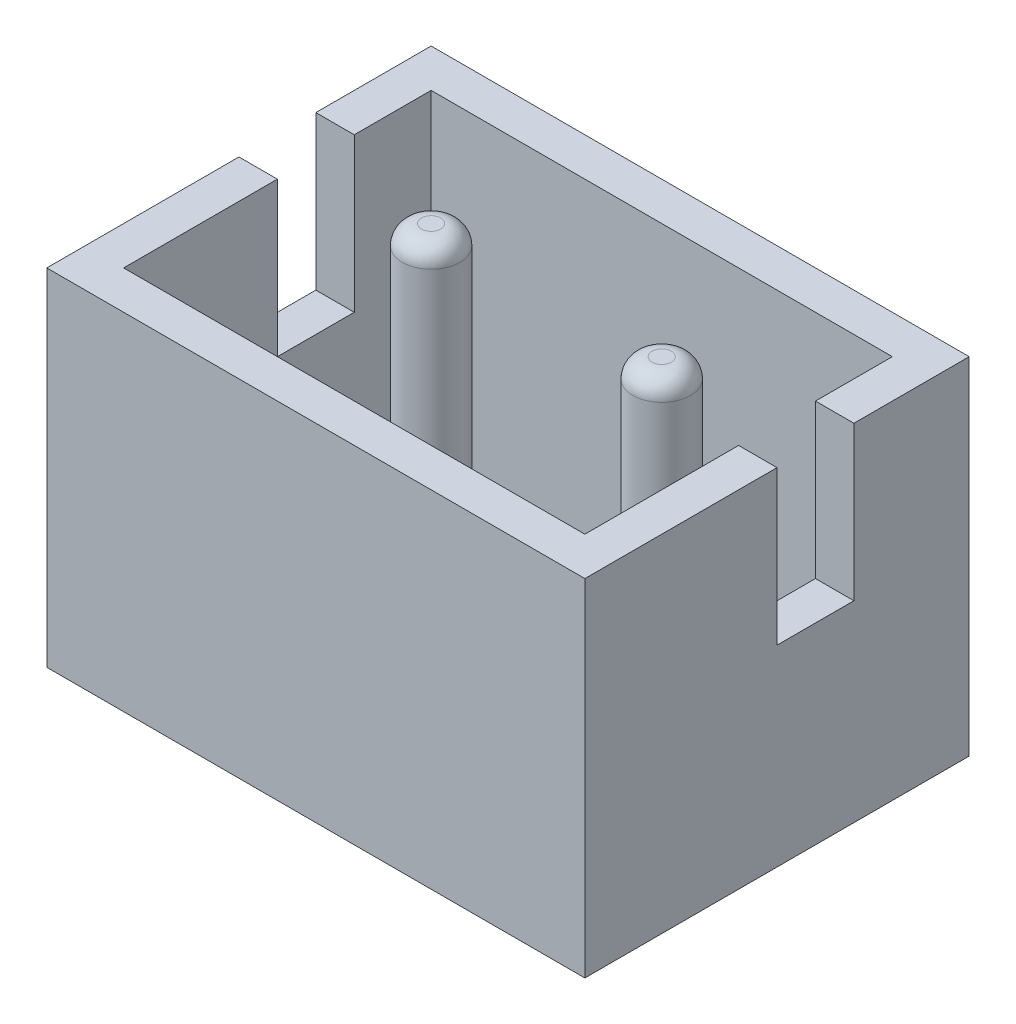
ISO-10303-21;
HEADER;
FILE_DESCRIPTION(('STEP AP214'),'2;1');
FILE_NAME('part.step','',(''),(''),'','','');
FILE_SCHEMA(('AUTOMOTIVE_DESIGN { 1 0 10303 214 1 1 1 1 }'));
ENDSEC;
DATA;
#1=APPLICATION_CONTEXT('core data for automotive mechanical design processes');
#2=APPLICATION_PROTOCOL_DEFINITION('international standard','automotive_design',2000,#1);
#3=PRODUCT_CONTEXT('',#1,'mechanical');
#4=PRODUCT('Part','Part','',(#3));
#5=PRODUCT_RELATED_PRODUCT_CATEGORY('part','',(#4));
#6=PRODUCT_DEFINITION_FORMATION('','',#4);
#7=PRODUCT_DEFINITION_CONTEXT('part definition',#1,'design');
#8=PRODUCT_DEFINITION('design','',#6,#7);
#9=PRODUCT_DEFINITION_SHAPE('','',#8);
#10=(LENGTH_UNIT() NAMED_UNIT(*) SI_UNIT(.MILLI.,.METRE.));
#11=(NAMED_UNIT(*) PLANE_ANGLE_UNIT() SI_UNIT($,.RADIAN.));
#12=(NAMED_UNIT(*) SI_UNIT($,.STERADIAN.) SOLID_ANGLE_UNIT());
#13=UNCERTAINTY_MEASURE_WITH_UNIT(LENGTH_MEASURE(1.E-05),#10,'distance_accuracy_value','');
#14=(GEOMETRIC_REPRESENTATION_CONTEXT(3) GLOBAL_UNCERTAINTY_ASSIGNED_CONTEXT((#13)) GLOBAL_UNIT_ASSIGNED_CONTEXT((#10,
#11,#12)) REPRESENTATION_CONTEXT('',''));
#15=CARTESIAN_POINT('',(0.,0.,0.));
#16=DIRECTION('',(0.,0.,1.));
#17=DIRECTION('',(1.,0.,0.));
#18=AXIS2_PLACEMENT_3D('',#15,#16,#17);
#19=CARTESIAN_POINT('',(3.,4.5,2.));
#20=DIRECTION('',(-1.,0.,0.));
#21=DIRECTION('',(0.,0.,1.));
#22=AXIS2_PLACEMENT_3D('',#19,#20,#21);
#23=PLANE('',#22);
#24=DIRECTION('',(0.,1.,0.));
#25=VECTOR('',#24,1.);
#26=CARTESIAN_POINT('',(3.,2.5,-1.));
#27=LINE('',#26,#25);
#28=CARTESIAN_POINT('',(3.,2.5,-1.));
#29=VERTEX_POINT('',#28);
#30=CARTESIAN_POINT('',(3.,4.5,-1.));
#31=VERTEX_POINT('',#30);
#32=EDGE_CURVE('E335',#29,#31,#27,.T.);
#33=ORIENTED_EDGE('',*,*,#32,.T.);
#34=DIRECTION('',(0.,0.,-1.));
#35=VECTOR('',#34,1.);
#36=CARTESIAN_POINT('',(3.,4.5,2.));
#37=LINE('',#36,#35);
#38=CARTESIAN_POINT('',(3.,4.5,-2.));
#39=VERTEX_POINT('',#38);
#40=EDGE_CURVE('E202',#31,#39,#37,.T.);
#41=ORIENTED_EDGE('',*,*,#40,.T.);
#42=DIRECTION('',(0.,-1.,0.));
#43=VECTOR('',#42,1.);
#44=CARTESIAN_POINT('',(3.,4.5,-2.));
#45=LINE('',#44,#43);
#46=CARTESIAN_POINT('',(3.,0.5,-2.));
#47=VERTEX_POINT('',#46);
#48=EDGE_CURVE('E209',#39,#47,#45,.T.);
#49=ORIENTED_EDGE('',*,*,#48,.T.);
#50=DIRECTION('',(0.,0.,-1.));
#51=VECTOR('',#50,1.);
#52=CARTESIAN_POINT('',(3.,0.5,2.));
#53=LINE('',#52,#51);
#54=CARTESIAN_POINT('',(3.,0.5,2.));
#55=VERTEX_POINT('',#54);
#56=EDGE_CURVE('E193',#55,#47,#53,.T.);
#57=ORIENTED_EDGE('',*,*,#56,.F.);
#58=DIRECTION('',(0.,-1.,0.));
#59=VECTOR('',#58,1.);
#60=CARTESIAN_POINT('',(3.,4.5,2.));
#61=LINE('',#60,#59);
#62=CARTESIAN_POINT('',(3.,4.5,2.));
#63=VERTEX_POINT('',#62);
#64=EDGE_CURVE('E186',#63,#55,#61,.T.);
#65=ORIENTED_EDGE('',*,*,#64,.F.);
#66=CARTESIAN_POINT('',(3.,4.5,0.));
#67=VERTEX_POINT('',#66);
#68=EDGE_CURVE('E327',#63,#67,#37,.T.);
#69=ORIENTED_EDGE('',*,*,#68,.T.);
#70=DIRECTION('',(0.,-1.,0.));
#71=VECTOR('',#70,1.);
#72=CARTESIAN_POINT('',(3.,4.5,0.));
#73=LINE('',#72,#71);
#74=CARTESIAN_POINT('',(3.,2.5,0.));
#75=VERTEX_POINT('',#74);
#76=EDGE_CURVE('E164',#67,#75,#73,.T.);
#77=ORIENTED_EDGE('',*,*,#76,.T.);
#78=DIRECTION('',(0.,0.,-1.));
#79=VECTOR('',#78,1.);
#80=CARTESIAN_POINT('',(3.,2.5,0.));
#81=LINE('',#80,#79);
#82=EDGE_CURVE('E358',#75,#29,#81,.T.);
#83=ORIENTED_EDGE('',*,*,#82,.T.);
#84=EDGE_LOOP('',(#33,#41,#49,#57,#65,#69,#77,#83));
#85=FACE_BOUND('',#84,.T.);
#86=ADVANCED_FACE('F39',(#85),#23,.T.);
#87=CARTESIAN_POINT('',(-3.,4.5,-2.));
#88=DIRECTION('',(0.,0.,1.));
#89=DIRECTION('',(1.,0.,0.));
#90=AXIS2_PLACEMENT_3D('',#87,#88,#89);
#91=PLANE('',#90);
#92=DIRECTION('',(-1.,0.,0.));
#93=VECTOR('',#92,1.);
#94=CARTESIAN_POINT('',(-3.,0.5,-2.));
#95=LINE('',#94,#93);
#96=CARTESIAN_POINT('',(-3.,0.5,-2.));
#97=VERTEX_POINT('',#96);
#98=EDGE_CURVE('E196',#47,#97,#95,.T.);
#99=ORIENTED_EDGE('',*,*,#98,.F.);
#100=ORIENTED_EDGE('',*,*,#48,.F.);
#101=DIRECTION('',(-1.,0.,0.));
#102=VECTOR('',#101,1.);
#103=CARTESIAN_POINT('',(-3.,4.5,-2.));
#104=LINE('',#103,#102);
#105=CARTESIAN_POINT('',(-3.,4.5,-2.));
#106=VERTEX_POINT('',#105);
#107=EDGE_CURVE('E189',#39,#106,#104,.T.);
#108=ORIENTED_EDGE('',*,*,#107,.T.);
#109=DIRECTION('',(0.,-1.,0.));
#110=VECTOR('',#109,1.);
#111=CARTESIAN_POINT('',(-3.,4.5,-2.));
#112=LINE('',#111,#110);
#113=EDGE_CURVE('E181',#106,#97,#112,.T.);
#114=ORIENTED_EDGE('',*,*,#113,.T.);
#115=EDGE_LOOP('',(#99,#100,#108,#114));
#116=FACE_BOUND('',#115,.T.);
#117=ADVANCED_FACE('F249',(#116),#91,.T.);
#118=CARTESIAN_POINT('',(-3.,4.5,2.));
#119=DIRECTION('',(1.,0.,0.));
#120=DIRECTION('',(0.,0.,-1.));
#121=AXIS2_PLACEMENT_3D('',#118,#119,#120);
#122=PLANE('',#121);
#123=DIRECTION('',(0.,-1.,0.));
#124=VECTOR('',#123,1.);
#125=CARTESIAN_POINT('',(-3.,2.5,-1.));
#126=LINE('',#125,#124);
#127=CARTESIAN_POINT('',(-3.,4.5,-1.));
#128=VERTEX_POINT('',#127);
#129=CARTESIAN_POINT('',(-3.,2.5,-1.));
#130=VERTEX_POINT('',#129);
#131=EDGE_CURVE('E154',#128,#130,#126,.T.);
#132=ORIENTED_EDGE('',*,*,#131,.T.);
#133=DIRECTION('',(0.,0.,1.));
#134=VECTOR('',#133,1.);
#135=CARTESIAN_POINT('',(-3.,2.5,0.));
#136=LINE('',#135,#134);
#137=CARTESIAN_POINT('',(-3.,2.5,0.));
#138=VERTEX_POINT('',#137);
#139=EDGE_CURVE('E165',#130,#138,#136,.T.);
#140=ORIENTED_EDGE('',*,*,#139,.T.);
#141=DIRECTION('',(0.,1.,0.));
#142=VECTOR('',#141,1.);
#143=CARTESIAN_POINT('',(-3.,4.5,0.));
#144=LINE('',#143,#142);
#145=CARTESIAN_POINT('',(-3.,4.5,0.));
#146=VERTEX_POINT('',#145);
#147=EDGE_CURVE('E346',#138,#146,#144,.T.);
#148=ORIENTED_EDGE('',*,*,#147,.T.);
#149=DIRECTION('',(0.,0.,1.));
#150=VECTOR('',#149,1.);
#151=CARTESIAN_POINT('',(-3.,4.5,2.));
#152=LINE('',#151,#150);
#153=CARTESIAN_POINT('',(-3.,4.5,2.));
#154=VERTEX_POINT('',#153);
#155=EDGE_CURVE('E183',#146,#154,#152,.T.);
#156=ORIENTED_EDGE('',*,*,#155,.T.);
#157=DIRECTION('',(0.,-1.,0.));
#158=VECTOR('',#157,1.);
#159=CARTESIAN_POINT('',(-3.,4.5,2.));
#160=LINE('',#159,#158);
#161=CARTESIAN_POINT('',(-3.,0.5,2.));
#162=VERTEX_POINT('',#161);
#163=EDGE_CURVE('E205',#154,#162,#160,.T.);
#164=ORIENTED_EDGE('',*,*,#163,.T.);
#165=DIRECTION('',(0.,0.,1.));
#166=VECTOR('',#165,1.);
#167=CARTESIAN_POINT('',(-3.,0.5,2.));
#168=LINE('',#167,#166);
#169=EDGE_CURVE('E198',#97,#162,#168,.T.);
#170=ORIENTED_EDGE('',*,*,#169,.F.);
#171=ORIENTED_EDGE('',*,*,#113,.F.);
#172=EDGE_CURVE('E169',#106,#128,#152,.T.);
#173=ORIENTED_EDGE('',*,*,#172,.T.);
#174=EDGE_LOOP('',(#132,#140,#148,#156,#164,#170,#171,#173));
#175=FACE_BOUND('',#174,.T.);
#176=ADVANCED_FACE('F178',(#175),#122,.T.);
#177=CARTESIAN_POINT('',(-3.,4.5,2.));
#178=DIRECTION('',(0.,0.,-1.));
#179=DIRECTION('',(-1.,0.,0.));
#180=AXIS2_PLACEMENT_3D('',#177,#178,#179);
#181=PLANE('',#180);
#182=DIRECTION('',(1.,0.,0.));
#183=VECTOR('',#182,1.);
#184=CARTESIAN_POINT('',(-3.,0.5,2.));
#185=LINE('',#184,#183);
#186=EDGE_CURVE('E200',#162,#55,#185,.T.);
#187=ORIENTED_EDGE('',*,*,#186,.F.);
#188=ORIENTED_EDGE('',*,*,#163,.F.);
#189=DIRECTION('',(1.,0.,0.));
#190=VECTOR('',#189,1.);
#191=CARTESIAN_POINT('',(-3.,4.5,2.));
#192=LINE('',#191,#190);
#193=EDGE_CURVE('E182',#154,#63,#192,.T.);
#194=ORIENTED_EDGE('',*,*,#193,.T.);
#195=ORIENTED_EDGE('',*,*,#64,.T.);
#196=EDGE_LOOP('',(#187,#188,#194,#195));
#197=FACE_BOUND('',#196,.T.);
#198=ADVANCED_FACE('F341',(#197),#181,.T.);
#199=CARTESIAN_POINT('',(0.,0.5,0.));
#200=DIRECTION('',(0.,1.,0.));
#201=DIRECTION('',(0.,0.,1.));
#202=AXIS2_PLACEMENT_3D('',#199,#200,#201);
#203=PLANE('',#202);
#204=CARTESIAN_POINT('',(1.5,0.5,-0.5));
#205=DIRECTION('',(0.,1.,0.));
#206=DIRECTION('',(0.,0.,1.));
#207=AXIS2_PLACEMENT_3D('',#204,#205,#206);
#208=CIRCLE('',#207,0.375);
#209=CARTESIAN_POINT('',(1.5,0.5,-0.125));
#210=VERTEX_POINT('',#209);
#211=EDGE_CURVE('E353',#210,#210,#208,.T.);
#212=ORIENTED_EDGE('',*,*,#211,.F.);
#213=EDGE_LOOP('',(#212));
#214=FACE_BOUND('',#213,.T.);
#215=CARTESIAN_POINT('',(-1.5,0.5,-0.5));
#216=DIRECTION('',(0.,1.,0.));
#217=DIRECTION('',(0.,0.,1.));
#218=AXIS2_PLACEMENT_3D('',#215,#216,#217);
#219=CIRCLE('',#218,0.375);
#220=CARTESIAN_POINT('',(-1.5,0.5,-0.125));
#221=VERTEX_POINT('',#220);
#222=EDGE_CURVE('E349',#221,#221,#219,.T.);
#223=ORIENTED_EDGE('',*,*,#222,.F.);
#224=EDGE_LOOP('',(#223));
#225=FACE_BOUND('',#224,.T.);
#226=ORIENTED_EDGE('',*,*,#56,.T.);
#227=ORIENTED_EDGE('',*,*,#98,.T.);
#228=ORIENTED_EDGE('',*,*,#169,.T.);
#229=ORIENTED_EDGE('',*,*,#186,.T.);
#230=EDGE_LOOP('',(#226,#227,#228,#229));
#231=FACE_BOUND('',#230,.T.);
#232=ADVANCED_FACE('F338',(#214,#225,#231),#203,.T.);
#233=CARTESIAN_POINT('',(-3.501,4.5,2.5));
#234=DIRECTION('',(0.,-1.,0.));
#235=DIRECTION('',(0.,0.,-1.));
#236=AXIS2_PLACEMENT_3D('',#233,#234,#235);
#237=PLANE('',#236);
#238=ORIENTED_EDGE('',*,*,#40,.F.);
#239=DIRECTION('',(1.,0.,0.));
#240=VECTOR('',#239,1.);
#241=CARTESIAN_POINT('',(-3.501,4.5,-1.));
#242=LINE('',#241,#240);
#243=CARTESIAN_POINT('',(3.5,4.5,-1.));
#244=VERTEX_POINT('',#243);
#245=EDGE_CURVE('E175',#31,#244,#242,.T.);
#246=ORIENTED_EDGE('',*,*,#245,.T.);
#247=DIRECTION('',(0.,0.,-1.));
#248=VECTOR('',#247,1.);
#249=CARTESIAN_POINT('',(3.5,4.5,-1.));
#250=LINE('',#249,#248);
#251=CARTESIAN_POINT('',(3.5,4.5,-2.5));
#252=VERTEX_POINT('',#251);
#253=EDGE_CURVE('E288',#244,#252,#250,.T.);
#254=ORIENTED_EDGE('',*,*,#253,.T.);
#255=DIRECTION('',(1.,0.,0.));
#256=VECTOR('',#255,1.);
#257=CARTESIAN_POINT('',(-3.501,4.5,-2.5));
#258=LINE('',#257,#256);
#259=CARTESIAN_POINT('',(-3.5,4.5,-2.5));
#260=VERTEX_POINT('',#259);
#261=EDGE_CURVE('E174',#260,#252,#258,.T.);
#262=ORIENTED_EDGE('',*,*,#261,.F.);
#263=DIRECTION('',(0.,0.,1.));
#264=VECTOR('',#263,1.);
#265=CARTESIAN_POINT('',(-3.5,4.5,-1.));
#266=LINE('',#265,#264);
#267=CARTESIAN_POINT('',(-3.5,4.5,-1.));
#268=VERTEX_POINT('',#267);
#269=EDGE_CURVE('E172',#260,#268,#266,.T.);
#270=ORIENTED_EDGE('',*,*,#269,.T.);
#271=EDGE_CURVE('E158',#268,#128,#242,.T.);
#272=ORIENTED_EDGE('',*,*,#271,.T.);
#273=ORIENTED_EDGE('',*,*,#172,.F.);
#274=ORIENTED_EDGE('',*,*,#107,.F.);
#275=EDGE_LOOP('',(#238,#246,#254,#262,#270,#272,#273,#274));
#276=FACE_BOUND('',#275,.T.);
#277=ADVANCED_FACE('F168',(#276),#237,.F.);
#278=CARTESIAN_POINT('',(-3.501,2.5,-1.));
#279=DIRECTION('',(0.,0.,-1.));
#280=DIRECTION('',(-1.,0.,0.));
#281=AXIS2_PLACEMENT_3D('',#278,#279,#280);
#282=PLANE('',#281);
#283=DIRECTION('',(0.,-1.,0.));
#284=VECTOR('',#283,1.);
#285=CARTESIAN_POINT('',(-3.5,2.5,-1.));
#286=LINE('',#285,#284);
#287=CARTESIAN_POINT('',(-3.5,2.5,-1.));
#288=VERTEX_POINT('',#287);
#289=EDGE_CURVE('E297',#268,#288,#286,.T.);
#290=ORIENTED_EDGE('',*,*,#289,.T.);
#291=DIRECTION('',(1.,0.,0.));
#292=VECTOR('',#291,1.);
#293=CARTESIAN_POINT('',(-3.501,2.5,-1.));
#294=LINE('',#293,#292);
#295=EDGE_CURVE('E160',#288,#130,#294,.T.);
#296=ORIENTED_EDGE('',*,*,#295,.T.);
#297=ORIENTED_EDGE('',*,*,#131,.F.);
#298=ORIENTED_EDGE('',*,*,#271,.F.);
#299=EDGE_LOOP('',(#290,#296,#297,#298));
#300=FACE_BOUND('',#299,.T.);
#301=ADVANCED_FACE('F157',(#300),#282,.F.);
#302=CARTESIAN_POINT('',(3.5,2.5,-1.));
#303=VERTEX_POINT('',#302);
#304=EDGE_CURVE('E318',#29,#303,#294,.T.);
#305=ORIENTED_EDGE('',*,*,#304,.T.);
#306=DIRECTION('',(0.,1.,0.));
#307=VECTOR('',#306,1.);
#308=CARTESIAN_POINT('',(3.5,2.5,-1.));
#309=LINE('',#308,#307);
#310=EDGE_CURVE('E312',#303,#244,#309,.T.);
#311=ORIENTED_EDGE('',*,*,#310,.T.);
#312=ORIENTED_EDGE('',*,*,#245,.F.);
#313=ORIENTED_EDGE('',*,*,#32,.F.);
#314=EDGE_LOOP('',(#305,#311,#312,#313));
#315=FACE_BOUND('',#314,.T.);
#316=ADVANCED_FACE('F413',(#315),#282,.F.);
#317=CARTESIAN_POINT('',(-3.501,2.5,0.));
#318=DIRECTION('',(0.,-1.,0.));
#319=DIRECTION('',(0.,0.,-1.));
#320=AXIS2_PLACEMENT_3D('',#317,#318,#319);
#321=PLANE('',#320);
#322=DIRECTION('',(0.,0.,1.));
#323=VECTOR('',#322,1.);
#324=CARTESIAN_POINT('',(-3.5,2.5,0.));
#325=LINE('',#324,#323);
#326=CARTESIAN_POINT('',(-3.5,2.5,0.));
#327=VERTEX_POINT('',#326);
#328=EDGE_CURVE('E303',#288,#327,#325,.T.);
#329=ORIENTED_EDGE('',*,*,#328,.T.);
#330=DIRECTION('',(1.,0.,0.));
#331=VECTOR('',#330,1.);
#332=CARTESIAN_POINT('',(-3.501,2.5,0.));
#333=LINE('',#332,#331);
#334=EDGE_CURVE('E320',#327,#138,#333,.T.);
#335=ORIENTED_EDGE('',*,*,#334,.T.);
#336=ORIENTED_EDGE('',*,*,#139,.F.);
#337=ORIENTED_EDGE('',*,*,#295,.F.);
#338=EDGE_LOOP('',(#329,#335,#336,#337));
#339=FACE_BOUND('',#338,.T.);
#340=ADVANCED_FACE('F366',(#339),#321,.F.);
#341=CARTESIAN_POINT('',(3.5,2.5,0.));
#342=VERTEX_POINT('',#341);
#343=EDGE_CURVE('E321',#75,#342,#333,.T.);
#344=ORIENTED_EDGE('',*,*,#343,.T.);
#345=DIRECTION('',(0.,0.,-1.));
#346=VECTOR('',#345,1.);
#347=CARTESIAN_POINT('',(3.5,2.5,0.));
#348=LINE('',#347,#346);
#349=EDGE_CURVE('E309',#342,#303,#348,.T.);
#350=ORIENTED_EDGE('',*,*,#349,.T.);
#351=ORIENTED_EDGE('',*,*,#304,.F.);
#352=ORIENTED_EDGE('',*,*,#82,.F.);
#353=EDGE_LOOP('',(#344,#350,#351,#352));
#354=FACE_BOUND('',#353,.T.);
#355=ADVANCED_FACE('F369',(#354),#321,.F.);
#356=CARTESIAN_POINT('',(-3.501,4.5,0.));
#357=DIRECTION('',(0.,0.,1.));
#358=DIRECTION('',(0.,-1.,0.));
#359=AXIS2_PLACEMENT_3D('',#356,#357,#358);
#360=PLANE('',#359);
#361=DIRECTION('',(0.,1.,0.));
#362=VECTOR('',#361,1.);
#363=CARTESIAN_POINT('',(-3.5,4.5,0.));
#364=LINE('',#363,#362);
#365=CARTESIAN_POINT('',(-3.5,4.5,0.));
#366=VERTEX_POINT('',#365);
#367=EDGE_CURVE('E361',#327,#366,#364,.T.);
#368=ORIENTED_EDGE('',*,*,#367,.T.);
#369=DIRECTION('',(1.,0.,0.));
#370=VECTOR('',#369,1.);
#371=CARTESIAN_POINT('',(-3.501,4.5,0.));
#372=LINE('',#371,#370);
#373=EDGE_CURVE('E323',#366,#146,#372,.T.);
#374=ORIENTED_EDGE('',*,*,#373,.T.);
#375=ORIENTED_EDGE('',*,*,#147,.F.);
#376=ORIENTED_EDGE('',*,*,#334,.F.);
#377=EDGE_LOOP('',(#368,#374,#375,#376));
#378=FACE_BOUND('',#377,.T.);
#379=ADVANCED_FACE('F367',(#378),#360,.F.);
#380=CARTESIAN_POINT('',(3.5,4.5,0.));
#381=VERTEX_POINT('',#380);
#382=EDGE_CURVE('E324',#67,#381,#372,.T.);
#383=ORIENTED_EDGE('',*,*,#382,.T.);
#384=DIRECTION('',(0.,-1.,0.));
#385=VECTOR('',#384,1.);
#386=CARTESIAN_POINT('',(3.5,4.5,0.));
#387=LINE('',#386,#385);
#388=EDGE_CURVE('E301',#381,#342,#387,.T.);
#389=ORIENTED_EDGE('',*,*,#388,.T.);
#390=ORIENTED_EDGE('',*,*,#343,.F.);
#391=ORIENTED_EDGE('',*,*,#76,.F.);
#392=EDGE_LOOP('',(#383,#389,#390,#391));
#393=FACE_BOUND('',#392,.T.);
#394=ADVANCED_FACE('F283',(#393),#360,.F.);
#395=ORIENTED_EDGE('',*,*,#68,.F.);
#396=ORIENTED_EDGE('',*,*,#193,.F.);
#397=ORIENTED_EDGE('',*,*,#155,.F.);
#398=ORIENTED_EDGE('',*,*,#373,.F.);
#399=DIRECTION('',(0.,0.,1.));
#400=VECTOR('',#399,1.);
#401=CARTESIAN_POINT('',(-3.5,4.5,2.5));
#402=LINE('',#401,#400);
#403=CARTESIAN_POINT('',(-3.5,4.5,2.5));
#404=VERTEX_POINT('',#403);
#405=EDGE_CURVE('E54',#366,#404,#402,.T.);
#406=ORIENTED_EDGE('',*,*,#405,.T.);
#407=DIRECTION('',(1.,0.,0.));
#408=VECTOR('',#407,1.);
#409=CARTESIAN_POINT('',(-3.501,4.5,2.5));
#410=LINE('',#409,#408);
#411=CARTESIAN_POINT('',(3.5,4.5,2.5));
#412=VERTEX_POINT('',#411);
#413=EDGE_CURVE('E316',#404,#412,#410,.T.);
#414=ORIENTED_EDGE('',*,*,#413,.T.);
#415=DIRECTION('',(0.,0.,-1.));
#416=VECTOR('',#415,1.);
#417=CARTESIAN_POINT('',(3.5,4.5,2.5));
#418=LINE('',#417,#416);
#419=EDGE_CURVE('E298',#412,#381,#418,.T.);
#420=ORIENTED_EDGE('',*,*,#419,.T.);
#421=ORIENTED_EDGE('',*,*,#382,.F.);
#422=EDGE_LOOP('',(#395,#396,#397,#398,#406,#414,#420,#421));
#423=FACE_BOUND('',#422,.T.);
#424=ADVANCED_FACE('F279',(#423),#237,.F.);
#425=CARTESIAN_POINT('',(3.5,5.,0.));
#426=DIRECTION('',(-1.,0.,0.));
#427=DIRECTION('',(0.,0.,1.));
#428=AXIS2_PLACEMENT_3D('',#425,#426,#427);
#429=PLANE('',#428);
#430=DIRECTION('',(0.,-1.,0.));
#431=VECTOR('',#430,1.);
#432=CARTESIAN_POINT('',(3.5,5.,-2.5));
#433=LINE('',#432,#431);
#434=CARTESIAN_POINT('',(3.5,0.,-2.5));
#435=VERTEX_POINT('',#434);
#436=EDGE_CURVE('E227',#252,#435,#433,.T.);
#437=ORIENTED_EDGE('',*,*,#436,.F.);
#438=ORIENTED_EDGE('',*,*,#253,.F.);
#439=ORIENTED_EDGE('',*,*,#310,.F.);
#440=ORIENTED_EDGE('',*,*,#349,.F.);
#441=ORIENTED_EDGE('',*,*,#388,.F.);
#442=ORIENTED_EDGE('',*,*,#419,.F.);
#443=DIRECTION('',(0.,-1.,0.));
#444=VECTOR('',#443,1.);
#445=CARTESIAN_POINT('',(3.5,5.,2.5));
#446=LINE('',#445,#444);
#447=CARTESIAN_POINT('',(3.5,0.,2.5));
#448=VERTEX_POINT('',#447);
#449=EDGE_CURVE('E62',#412,#448,#446,.T.);
#450=ORIENTED_EDGE('',*,*,#449,.T.);
#451=DIRECTION('',(0.,0.,-1.));
#452=VECTOR('',#451,1.);
#453=CARTESIAN_POINT('',(3.5,0.,0.));
#454=LINE('',#453,#452);
#455=EDGE_CURVE('E212',#448,#435,#454,.T.);
#456=ORIENTED_EDGE('',*,*,#455,.T.);
#457=EDGE_LOOP('',(#437,#438,#439,#440,#441,#442,#450,#456));
#458=FACE_BOUND('',#457,.T.);
#459=ADVANCED_FACE('F276',(#458),#429,.F.);
#460=CARTESIAN_POINT('',(0.,5.,-2.5));
#461=DIRECTION('',(0.,0.,1.));
#462=DIRECTION('',(1.,0.,0.));
#463=AXIS2_PLACEMENT_3D('',#460,#461,#462);
#464=PLANE('',#463);
#465=DIRECTION('',(0.,-1.,0.));
#466=VECTOR('',#465,1.);
#467=CARTESIAN_POINT('',(-3.5,5.,-2.5));
#468=LINE('',#467,#466);
#469=CARTESIAN_POINT('',(-3.5,0.,-2.5));
#470=VERTEX_POINT('',#469);
#471=EDGE_CURVE('E225',#260,#470,#468,.T.);
#472=ORIENTED_EDGE('',*,*,#471,.F.);
#473=ORIENTED_EDGE('',*,*,#261,.T.);
#474=ORIENTED_EDGE('',*,*,#436,.T.);
#475=DIRECTION('',(-1.,0.,0.));
#476=VECTOR('',#475,1.);
#477=CARTESIAN_POINT('',(0.,0.,-2.5));
#478=LINE('',#477,#476);
#479=EDGE_CURVE('E214',#435,#470,#478,.T.);
#480=ORIENTED_EDGE('',*,*,#479,.T.);
#481=EDGE_LOOP('',(#472,#473,#474,#480));
#482=FACE_BOUND('',#481,.T.);
#483=ADVANCED_FACE('F272',(#482),#464,.F.);
#484=CARTESIAN_POINT('',(-3.5,5.,0.));
#485=DIRECTION('',(1.,0.,0.));
#486=DIRECTION('',(0.,0.,-1.));
#487=AXIS2_PLACEMENT_3D('',#484,#485,#486);
#488=PLANE('',#487);
#489=DIRECTION('',(0.,-1.,0.));
#490=VECTOR('',#489,1.);
#491=CARTESIAN_POINT('',(-3.5,5.,2.5));
#492=LINE('',#491,#490);
#493=CARTESIAN_POINT('',(-3.5,0.,2.5));
#494=VERTEX_POINT('',#493);
#495=EDGE_CURVE('E223',#404,#494,#492,.T.);
#496=ORIENTED_EDGE('',*,*,#495,.F.);
#497=ORIENTED_EDGE('',*,*,#405,.F.);
#498=ORIENTED_EDGE('',*,*,#367,.F.);
#499=ORIENTED_EDGE('',*,*,#328,.F.);
#500=ORIENTED_EDGE('',*,*,#289,.F.);
#501=ORIENTED_EDGE('',*,*,#269,.F.);
#502=ORIENTED_EDGE('',*,*,#471,.T.);
#503=DIRECTION('',(0.,0.,1.));
#504=VECTOR('',#503,1.);
#505=CARTESIAN_POINT('',(-3.5,0.,0.));
#506=LINE('',#505,#504);
#507=EDGE_CURVE('E217',#470,#494,#506,.T.);
#508=ORIENTED_EDGE('',*,*,#507,.T.);
#509=EDGE_LOOP('',(#496,#497,#498,#499,#500,#501,#502,#508));
#510=FACE_BOUND('',#509,.T.);
#511=ADVANCED_FACE('F268',(#510),#488,.F.);
#512=CARTESIAN_POINT('',(0.,5.,2.5));
#513=DIRECTION('',(0.,0.,-1.));
#514=DIRECTION('',(-1.,0.,0.));
#515=AXIS2_PLACEMENT_3D('',#512,#513,#514);
#516=PLANE('',#515);
#517=ORIENTED_EDGE('',*,*,#449,.F.);
#518=ORIENTED_EDGE('',*,*,#413,.F.);
#519=ORIENTED_EDGE('',*,*,#495,.T.);
#520=DIRECTION('',(1.,0.,0.));
#521=VECTOR('',#520,1.);
#522=CARTESIAN_POINT('',(0.,0.,2.5));
#523=LINE('',#522,#521);
#524=EDGE_CURVE('E220',#494,#448,#523,.T.);
#525=ORIENTED_EDGE('',*,*,#524,.T.);
#526=EDGE_LOOP('',(#517,#518,#519,#525));
#527=FACE_BOUND('',#526,.T.);
#528=ADVANCED_FACE('F264',(#527),#516,.F.);
#529=CARTESIAN_POINT('',(0.,0.,0.));
#530=DIRECTION('',(0.,1.,0.));
#531=DIRECTION('',(0.,0.,1.));
#532=AXIS2_PLACEMENT_3D('',#529,#530,#531);
#533=PLANE('',#532);
#534=ORIENTED_EDGE('',*,*,#455,.F.);
#535=ORIENTED_EDGE('',*,*,#524,.F.);
#536=ORIENTED_EDGE('',*,*,#507,.F.);
#537=ORIENTED_EDGE('',*,*,#479,.F.);
#538=EDGE_LOOP('',(#534,#535,#536,#537));
#539=FACE_BOUND('',#538,.T.);
#540=ADVANCED_FACE('F260',(#539),#533,.F.);
#541=CARTESIAN_POINT('',(-1.5,4.5,-0.5));
#542=DIRECTION('',(0.,-1.,0.));
#543=DIRECTION('',(0.,0.,-1.));
#544=AXIS2_PLACEMENT_3D('',#541,#542,#543);
#545=CYLINDRICAL_SURFACE('',#544,0.375);
#546=CARTESIAN_POINT('',(-1.5,4.25,-0.5));
#547=DIRECTION('',(0.,1.,0.));
#548=DIRECTION('',(0.,0.,1.));
#549=AXIS2_PLACEMENT_3D('',#546,#547,#548);
#550=CIRCLE('',#549,0.375);
#551=CARTESIAN_POINT('',(-1.5,4.25,-0.125));
#552=VERTEX_POINT('',#551);
#553=EDGE_CURVE('E11',#552,#552,#550,.F.);
#554=ORIENTED_EDGE('',*,*,#553,.T.);
#555=EDGE_LOOP('',(#554));
#556=FACE_BOUND('',#555,.T.);
#557=ORIENTED_EDGE('',*,*,#222,.T.);
#558=EDGE_LOOP('',(#557));
#559=FACE_BOUND('',#558,.T.);
#560=ADVANCED_FACE('F263',(#556,#559),#545,.T.);
#561=CARTESIAN_POINT('',(-1.5,4.5,-0.5));
#562=DIRECTION('',(0.,1.,0.));
#563=DIRECTION('',(0.,0.,1.));
#564=AXIS2_PLACEMENT_3D('',#561,#562,#563);
#565=PLANE('',#564);
#566=CARTESIAN_POINT('',(-1.5,4.5,-0.5));
#567=DIRECTION('',(0.,1.,0.));
#568=DIRECTION('',(0.,0.,1.));
#569=AXIS2_PLACEMENT_3D('',#566,#567,#568);
#570=CIRCLE('',#569,0.125);
#571=CARTESIAN_POINT('',(-1.5,4.5,-0.375));
#572=VERTEX_POINT('',#571);
#573=EDGE_CURVE('E47',#572,#572,#570,.T.);
#574=ORIENTED_EDGE('',*,*,#573,.T.);
#575=EDGE_LOOP('',(#574));
#576=FACE_BOUND('',#575,.T.);
#577=ADVANCED_FACE('F237',(#576),#565,.T.);
#578=CARTESIAN_POINT('',(1.5,4.5,-0.5));
#579=DIRECTION('',(0.,-1.,0.));
#580=DIRECTION('',(0.,0.,-1.));
#581=AXIS2_PLACEMENT_3D('',#578,#579,#580);
#582=CYLINDRICAL_SURFACE('',#581,0.375);
#583=CARTESIAN_POINT('',(1.5,4.25,-0.5));
#584=DIRECTION('',(0.,1.,0.));
#585=DIRECTION('',(0.,0.,1.));
#586=AXIS2_PLACEMENT_3D('',#583,#584,#585);
#587=CIRCLE('',#586,0.375);
#588=CARTESIAN_POINT('',(1.5,4.25,-0.125));
#589=VERTEX_POINT('',#588);
#590=EDGE_CURVE('E232',#589,#589,#587,.F.);
#591=ORIENTED_EDGE('',*,*,#590,.T.);
#592=EDGE_LOOP('',(#591));
#593=FACE_BOUND('',#592,.T.);
#594=ORIENTED_EDGE('',*,*,#211,.T.);
#595=EDGE_LOOP('',(#594));
#596=FACE_BOUND('',#595,.T.);
#597=ADVANCED_FACE('F484',(#593,#596),#582,.T.);
#598=CARTESIAN_POINT('',(1.5,4.5,-0.5));
#599=DIRECTION('',(0.,1.,0.));
#600=DIRECTION('',(0.,0.,1.));
#601=AXIS2_PLACEMENT_3D('',#598,#599,#600);
#602=PLANE('',#601);
#603=CARTESIAN_POINT('',(1.5,4.5,-0.5));
#604=DIRECTION('',(0.,1.,0.));
#605=DIRECTION('',(0.,0.,1.));
#606=AXIS2_PLACEMENT_3D('',#603,#604,#605);
#607=CIRCLE('',#606,0.125);
#608=CARTESIAN_POINT('',(1.5,4.5,-0.375));
#609=VERTEX_POINT('',#608);
#610=EDGE_CURVE('E229',#609,#609,#607,.T.);
#611=ORIENTED_EDGE('',*,*,#610,.T.);
#612=EDGE_LOOP('',(#611));
#613=FACE_BOUND('',#612,.T.);
#614=ADVANCED_FACE('F245',(#613),#602,.T.);
#615=CARTESIAN_POINT('',(1.5,4.25,-0.5));
#616=DIRECTION('',(0.,1.,0.));
#617=DIRECTION('',(0.,0.,1.));
#618=AXIS2_PLACEMENT_3D('',#615,#616,#617);
#619=DEGENERATE_TOROIDAL_SURFACE('',#618,0.125,0.25,.T.);
#620=ORIENTED_EDGE('',*,*,#590,.F.);
#621=EDGE_LOOP('',(#620));
#622=FACE_BOUND('',#621,.T.);
#623=ORIENTED_EDGE('',*,*,#610,.F.);
#624=EDGE_LOOP('',(#623));
#625=FACE_BOUND('',#624,.T.);
#626=ADVANCED_FACE('F240',(#622,#625),#619,.T.);
#627=CARTESIAN_POINT('',(-1.5,4.25,-0.5));
#628=DIRECTION('',(0.,1.,0.));
#629=DIRECTION('',(0.,0.,1.));
#630=AXIS2_PLACEMENT_3D('',#627,#628,#629);
#631=DEGENERATE_TOROIDAL_SURFACE('',#630,0.125,0.25,.T.);
#632=ORIENTED_EDGE('',*,*,#553,.F.);
#633=EDGE_LOOP('',(#632));
#634=FACE_BOUND('',#633,.T.);
#635=ORIENTED_EDGE('',*,*,#573,.F.);
#636=EDGE_LOOP('',(#635));
#637=FACE_BOUND('',#636,.T.);
#638=ADVANCED_FACE('F41',(#634,#637),#631,.T.);
#639=CLOSED_SHELL('',(#86,#117,#176,#198,#232,#277,#301,#316,#340,#355,#379,#394,#424,#459,#483,
#511,#528,#540,#560,#577,#597,#614,#626,#638));
#640=MANIFOLD_SOLID_BREP('B2',#639);
#641=ADVANCED_BREP_SHAPE_REPRESENTATION('',(#18,#640),#14);
#642=SHAPE_DEFINITION_REPRESENTATION(#9,#641);
ENDSEC;
END-ISO-10303-21;
